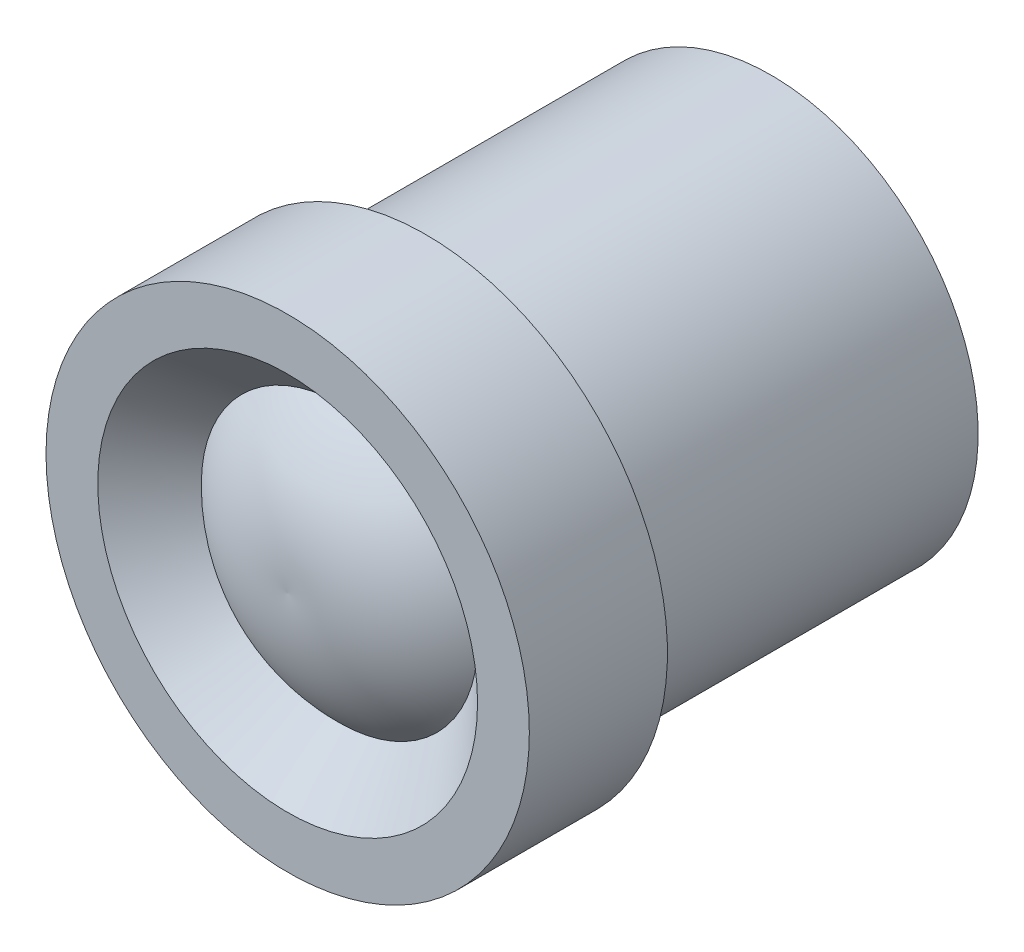
ISO-10303-21;
HEADER;
FILE_DESCRIPTION(('STEP AP214'),'2;1');
FILE_NAME('part.step','',(''),(''),'','','');
FILE_SCHEMA(('AUTOMOTIVE_DESIGN { 1 0 10303 214 1 1 1 1 }'));
ENDSEC;
DATA;
#1=APPLICATION_CONTEXT('core data for automotive mechanical design processes');
#2=APPLICATION_PROTOCOL_DEFINITION('international standard','automotive_design',2000,#1);
#3=PRODUCT_CONTEXT('',#1,'mechanical');
#4=PRODUCT('Part','Part','',(#3));
#5=PRODUCT_RELATED_PRODUCT_CATEGORY('part','',(#4));
#6=PRODUCT_DEFINITION_FORMATION('','',#4);
#7=PRODUCT_DEFINITION_CONTEXT('part definition',#1,'design');
#8=PRODUCT_DEFINITION('design','',#6,#7);
#9=PRODUCT_DEFINITION_SHAPE('','',#8);
#10=(LENGTH_UNIT() NAMED_UNIT(*) SI_UNIT(.MILLI.,.METRE.));
#11=(NAMED_UNIT(*) PLANE_ANGLE_UNIT() SI_UNIT($,.RADIAN.));
#12=(NAMED_UNIT(*) SI_UNIT($,.STERADIAN.) SOLID_ANGLE_UNIT());
#13=UNCERTAINTY_MEASURE_WITH_UNIT(LENGTH_MEASURE(1.E-05),#10,'distance_accuracy_value','');
#14=(GEOMETRIC_REPRESENTATION_CONTEXT(3) GLOBAL_UNCERTAINTY_ASSIGNED_CONTEXT((#13)) GLOBAL_UNIT_ASSIGNED_CONTEXT((#10,
#11,#12)) REPRESENTATION_CONTEXT('',''));
#15=CARTESIAN_POINT('',(0.,0.,0.));
#16=DIRECTION('',(0.,0.,1.));
#17=DIRECTION('',(1.,0.,0.));
#18=AXIS2_PLACEMENT_3D('',#15,#16,#17);
#19=CARTESIAN_POINT('',(0.,0.,14.));
#20=DIRECTION('',(0.,0.,-1.));
#21=DIRECTION('',(-1.,0.,0.));
#22=AXIS2_PLACEMENT_3D('',#19,#20,#21);
#23=CYLINDRICAL_SURFACE('',#22,7.);
#24=CARTESIAN_POINT('',(0.,0.,14.));
#25=DIRECTION('',(0.,0.,1.));
#26=DIRECTION('',(1.,0.,0.));
#27=AXIS2_PLACEMENT_3D('',#24,#25,#26);
#28=CIRCLE('',#27,7.);
#29=CARTESIAN_POINT('',(7.,0.,14.));
#30=VERTEX_POINT('',#29);
#31=EDGE_CURVE('E12',#30,#30,#28,.T.);
#32=ORIENTED_EDGE('',*,*,#31,.F.);
#33=EDGE_LOOP('',(#32));
#34=FACE_BOUND('',#33,.T.);
#35=CARTESIAN_POINT('',(0.,0.,10.));
#36=DIRECTION('',(0.,0.,-1.));
#37=DIRECTION('',(-1.,0.,0.));
#38=AXIS2_PLACEMENT_3D('',#35,#36,#37);
#39=CIRCLE('',#38,7.);
#40=CARTESIAN_POINT('',(-7.,0.,10.));
#41=VERTEX_POINT('',#40);
#42=EDGE_CURVE('E40',#41,#41,#39,.T.);
#43=ORIENTED_EDGE('',*,*,#42,.F.);
#44=EDGE_LOOP('',(#43));
#45=FACE_BOUND('',#44,.T.);
#46=ADVANCED_FACE('F37',(#34,#45),#23,.T.);
#47=CARTESIAN_POINT('',(0.,0.,14.));
#48=DIRECTION('',(0.,0.,1.));
#49=DIRECTION('',(1.,0.,0.));
#50=AXIS2_PLACEMENT_3D('',#47,#48,#49);
#51=PLANE('',#50);
#52=CARTESIAN_POINT('',(0.,0.,14.));
#53=DIRECTION('',(0.,0.,1.));
#54=DIRECTION('',(1.,0.,0.));
#55=AXIS2_PLACEMENT_3D('',#52,#53,#54);
#56=CIRCLE('',#55,5.5);
#57=CARTESIAN_POINT('',(5.5,0.,14.));
#58=VERTEX_POINT('',#57);
#59=EDGE_CURVE('E55',#58,#58,#56,.T.);
#60=ORIENTED_EDGE('',*,*,#59,.F.);
#61=EDGE_LOOP('',(#60));
#62=FACE_BOUND('',#61,.T.);
#63=ORIENTED_EDGE('',*,*,#31,.T.);
#64=EDGE_LOOP('',(#63));
#65=FACE_BOUND('',#64,.T.);
#66=ADVANCED_FACE('F78',(#62,#65),#51,.T.);
#67=CARTESIAN_POINT('',(0.,0.,10.));
#68=DIRECTION('',(0.,0.,-1.));
#69=DIRECTION('',(-1.,0.,0.));
#70=AXIS2_PLACEMENT_3D('',#67,#68,#69);
#71=PLANE('',#70);
#72=CARTESIAN_POINT('',(0.,0.,10.));
#73=DIRECTION('',(0.,0.,-1.));
#74=DIRECTION('',(-1.,0.,0.));
#75=AXIS2_PLACEMENT_3D('',#72,#73,#74);
#76=CIRCLE('',#75,6.);
#77=CARTESIAN_POINT('',(-6.,0.,10.));
#78=VERTEX_POINT('',#77);
#79=EDGE_CURVE('E61',#78,#78,#76,.T.);
#80=ORIENTED_EDGE('',*,*,#79,.F.);
#81=EDGE_LOOP('',(#80));
#82=FACE_BOUND('',#81,.T.);
#83=ORIENTED_EDGE('',*,*,#42,.T.);
#84=EDGE_LOOP('',(#83));
#85=FACE_BOUND('',#84,.T.);
#86=ADVANCED_FACE('F71',(#82,#85),#71,.T.);
#87=CARTESIAN_POINT('',(0.,0.,10.));
#88=DIRECTION('',(0.,0.,-1.));
#89=DIRECTION('',(-1.,0.,0.));
#90=AXIS2_PLACEMENT_3D('',#87,#88,#89);
#91=CYLINDRICAL_SURFACE('',#90,6.);
#92=ORIENTED_EDGE('',*,*,#79,.T.);
#93=EDGE_LOOP('',(#92));
#94=FACE_BOUND('',#93,.T.);
#95=CARTESIAN_POINT('',(0.,0.,0.));
#96=DIRECTION('',(0.,0.,-1.));
#97=DIRECTION('',(-1.,0.,0.));
#98=AXIS2_PLACEMENT_3D('',#95,#96,#97);
#99=CIRCLE('',#98,6.);
#100=CARTESIAN_POINT('',(-6.,0.,0.));
#101=VERTEX_POINT('',#100);
#102=EDGE_CURVE('E58',#101,#101,#99,.T.);
#103=ORIENTED_EDGE('',*,*,#102,.F.);
#104=EDGE_LOOP('',(#103));
#105=FACE_BOUND('',#104,.T.);
#106=ADVANCED_FACE('F69',(#94,#105),#91,.T.);
#107=CARTESIAN_POINT('',(0.,0.,0.));
#108=DIRECTION('',(0.,0.,1.));
#109=DIRECTION('',(1.,0.,0.));
#110=AXIS2_PLACEMENT_3D('',#107,#108,#109);
#111=PLANE('',#110);
#112=ORIENTED_EDGE('',*,*,#102,.T.);
#113=EDGE_LOOP('',(#112));
#114=FACE_BOUND('',#113,.T.);
#115=ADVANCED_FACE('F67',(#114),#111,.F.);
#116=CARTESIAN_POINT('',(0.,0.,14.));
#117=DIRECTION('',(0.,0.,1.));
#118=DIRECTION('',(1.,0.,0.));
#119=AXIS2_PLACEMENT_3D('',#116,#117,#118);
#120=CONICAL_SURFACE('',#119,5.5,0.78539816339745);
#121=CARTESIAN_POINT('',(0.,0.,12.5));
#122=DIRECTION('',(0.,0.,1.));
#123=DIRECTION('',(1.,0.,0.));
#124=AXIS2_PLACEMENT_3D('',#121,#122,#123);
#125=CIRCLE('',#124,3.99999999999999);
#126=CARTESIAN_POINT('',(3.99999999999999,0.,12.5));
#127=VERTEX_POINT('',#126);
#128=EDGE_CURVE('E53',#127,#127,#125,.T.);
#129=ORIENTED_EDGE('',*,*,#128,.F.);
#130=EDGE_LOOP('',(#129));
#131=FACE_BOUND('',#130,.T.);
#132=ORIENTED_EDGE('',*,*,#59,.T.);
#133=EDGE_LOOP('',(#132));
#134=FACE_BOUND('',#133,.T.);
#135=ADVANCED_FACE('F49',(#131,#134),#120,.F.);
#136=CARTESIAN_POINT('',(-0.412646296245877,0.,9.01705678998902));
#137=DIRECTION('',(0.,-1.,0.));
#138=DIRECTION('',(-1.,0.,0.));
#139=AXIS2_PLACEMENT_3D('',#136,#137,#138);
#140=CIRCLE('',#139,5.);
#141=TRIMMED_CURVE('',#140,(PARAMETER_VALUE(-1.65341955990417)),
(PARAMETER_VALUE(1.65341955990417)),.T.,.PARAMETER.);
#142=CARTESIAN_POINT('',(0.,0.,9.01705678998902));
#143=DIRECTION('',(0.,0.,-1.));
#144=AXIS1_PLACEMENT('',#142,#143);
#145=SURFACE_OF_REVOLUTION('',#141,#144);
#146=CARTESIAN_POINT('',(0.,0.,14.));
#147=VERTEX_POINT('',#146);
#148=VERTEX_LOOP('',#147);
#149=FACE_BOUND('',#148,.T.);
#150=ORIENTED_EDGE('',*,*,#128,.T.);
#151=EDGE_LOOP('',(#150));
#152=FACE_BOUND('',#151,.T.);
#153=ADVANCED_FACE('F46',(#149,#152),#145,.T.);
#154=CLOSED_SHELL('',(#46,#66,#86,#106,#115,#135,#153));
#155=MANIFOLD_SOLID_BREP('B2',#154);
#156=ADVANCED_BREP_SHAPE_REPRESENTATION('',(#18,#155),#14);
#157=SHAPE_DEFINITION_REPRESENTATION(#9,#156);
ENDSEC;
END-ISO-10303-21;
